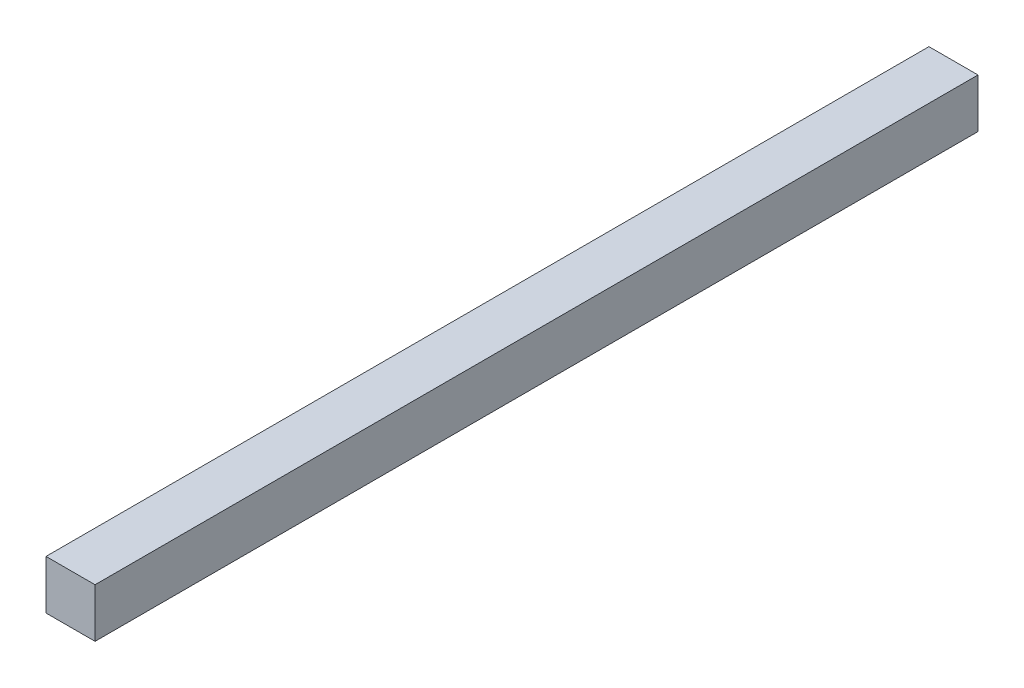
ISO-10303-21;
HEADER;
FILE_DESCRIPTION(('STEP AP214'),'2;1');
FILE_NAME('part.step','',(''),(''),'','','');
FILE_SCHEMA(('AUTOMOTIVE_DESIGN { 1 0 10303 214 1 1 1 1 }'));
ENDSEC;
DATA;
#1=APPLICATION_CONTEXT('core data for automotive mechanical design processes');
#2=APPLICATION_PROTOCOL_DEFINITION('international standard','automotive_design',2000,#1);
#3=PRODUCT_CONTEXT('',#1,'mechanical');
#4=PRODUCT('Part','Part','',(#3));
#5=PRODUCT_RELATED_PRODUCT_CATEGORY('part','',(#4));
#6=PRODUCT_DEFINITION_FORMATION('','',#4);
#7=PRODUCT_DEFINITION_CONTEXT('part definition',#1,'design');
#8=PRODUCT_DEFINITION('design','',#6,#7);
#9=PRODUCT_DEFINITION_SHAPE('','',#8);
#10=(LENGTH_UNIT() NAMED_UNIT(*) SI_UNIT(.MILLI.,.METRE.));
#11=(NAMED_UNIT(*) PLANE_ANGLE_UNIT() SI_UNIT($,.RADIAN.));
#12=(NAMED_UNIT(*) SI_UNIT($,.STERADIAN.) SOLID_ANGLE_UNIT());
#13=UNCERTAINTY_MEASURE_WITH_UNIT(LENGTH_MEASURE(1.E-05),#10,'distance_accuracy_value','');
#14=(GEOMETRIC_REPRESENTATION_CONTEXT(3) GLOBAL_UNCERTAINTY_ASSIGNED_CONTEXT((#13)) GLOBAL_UNIT_ASSIGNED_CONTEXT((#10,
#11,#12)) REPRESENTATION_CONTEXT('',''));
#15=CARTESIAN_POINT('',(0.,0.,0.));
#16=DIRECTION('',(0.,0.,1.));
#17=DIRECTION('',(1.,0.,0.));
#18=AXIS2_PLACEMENT_3D('',#15,#16,#17);
#19=CARTESIAN_POINT('',(20.,-20.,720.));
#20=DIRECTION('',(-1.,0.,0.));
#21=DIRECTION('',(0.,0.,1.));
#22=AXIS2_PLACEMENT_3D('',#19,#20,#21);
#23=PLANE('',#22);
#24=DIRECTION('',(0.,1.,0.));
#25=VECTOR('',#24,1.);
#26=CARTESIAN_POINT('',(20.,-20.,0.));
#27=LINE('',#26,#25);
#28=CARTESIAN_POINT('',(20.,-20.,0.));
#29=VERTEX_POINT('',#28);
#30=CARTESIAN_POINT('',(20.,20.,0.));
#31=VERTEX_POINT('',#30);
#32=EDGE_CURVE('E105',#29,#31,#27,.T.);
#33=ORIENTED_EDGE('',*,*,#32,.T.);
#34=DIRECTION('',(0.,0.,-1.));
#35=VECTOR('',#34,1.);
#36=CARTESIAN_POINT('',(20.,20.,720.));
#37=LINE('',#36,#35);
#38=CARTESIAN_POINT('',(20.,20.,720.));
#39=VERTEX_POINT('',#38);
#40=EDGE_CURVE('E11',#39,#31,#37,.T.);
#41=ORIENTED_EDGE('',*,*,#40,.F.);
#42=DIRECTION('',(0.,1.,0.));
#43=VECTOR('',#42,1.);
#44=CARTESIAN_POINT('',(20.,-20.,720.));
#45=LINE('',#44,#43);
#46=CARTESIAN_POINT('',(20.,-20.,720.));
#47=VERTEX_POINT('',#46);
#48=EDGE_CURVE('E89',#47,#39,#45,.T.);
#49=ORIENTED_EDGE('',*,*,#48,.F.);
#50=DIRECTION('',(0.,0.,-1.));
#51=VECTOR('',#50,1.);
#52=CARTESIAN_POINT('',(20.,-20.,720.));
#53=LINE('',#52,#51);
#54=EDGE_CURVE('E98',#47,#29,#53,.T.);
#55=ORIENTED_EDGE('',*,*,#54,.T.);
#56=EDGE_LOOP('',(#33,#41,#49,#55));
#57=FACE_BOUND('',#56,.T.);
#58=ADVANCED_FACE('F39',(#57),#23,.F.);
#59=CARTESIAN_POINT('',(-20.,20.,720.));
#60=DIRECTION('',(0.,-1.,0.));
#61=DIRECTION('',(0.,0.,-1.));
#62=AXIS2_PLACEMENT_3D('',#59,#60,#61);
#63=PLANE('',#62);
#64=DIRECTION('',(-1.,0.,0.));
#65=VECTOR('',#64,1.);
#66=CARTESIAN_POINT('',(-20.,20.,0.));
#67=LINE('',#66,#65);
#68=CARTESIAN_POINT('',(-20.,20.,0.));
#69=VERTEX_POINT('',#68);
#70=EDGE_CURVE('E94',#31,#69,#67,.T.);
#71=ORIENTED_EDGE('',*,*,#70,.T.);
#72=DIRECTION('',(0.,0.,-1.));
#73=VECTOR('',#72,1.);
#74=CARTESIAN_POINT('',(-20.,20.,720.));
#75=LINE('',#74,#73);
#76=CARTESIAN_POINT('',(-20.,20.,720.));
#77=VERTEX_POINT('',#76);
#78=EDGE_CURVE('E50',#77,#69,#75,.T.);
#79=ORIENTED_EDGE('',*,*,#78,.F.);
#80=DIRECTION('',(-1.,0.,0.));
#81=VECTOR('',#80,1.);
#82=CARTESIAN_POINT('',(-20.,20.,720.));
#83=LINE('',#82,#81);
#84=EDGE_CURVE('E83',#39,#77,#83,.T.);
#85=ORIENTED_EDGE('',*,*,#84,.F.);
#86=ORIENTED_EDGE('',*,*,#40,.T.);
#87=EDGE_LOOP('',(#71,#79,#85,#86));
#88=FACE_BOUND('',#87,.T.);
#89=ADVANCED_FACE('F91',(#88),#63,.F.);
#90=CARTESIAN_POINT('',(-20.,-20.,720.));
#91=DIRECTION('',(1.,0.,0.));
#92=DIRECTION('',(0.,0.,-1.));
#93=AXIS2_PLACEMENT_3D('',#90,#91,#92);
#94=PLANE('',#93);
#95=DIRECTION('',(0.,-1.,0.));
#96=VECTOR('',#95,1.);
#97=CARTESIAN_POINT('',(-20.,-20.,0.));
#98=LINE('',#97,#96);
#99=CARTESIAN_POINT('',(-20.,-20.,0.));
#100=VERTEX_POINT('',#99);
#101=EDGE_CURVE('E75',#69,#100,#98,.T.);
#102=ORIENTED_EDGE('',*,*,#101,.T.);
#103=DIRECTION('',(0.,0.,-1.));
#104=VECTOR('',#103,1.);
#105=CARTESIAN_POINT('',(-20.,-20.,720.));
#106=LINE('',#105,#104);
#107=CARTESIAN_POINT('',(-20.,-20.,720.));
#108=VERTEX_POINT('',#107);
#109=EDGE_CURVE('E92',#108,#100,#106,.T.);
#110=ORIENTED_EDGE('',*,*,#109,.F.);
#111=DIRECTION('',(0.,-1.,0.));
#112=VECTOR('',#111,1.);
#113=CARTESIAN_POINT('',(-20.,-20.,720.));
#114=LINE('',#113,#112);
#115=EDGE_CURVE('E86',#77,#108,#114,.T.);
#116=ORIENTED_EDGE('',*,*,#115,.F.);
#117=ORIENTED_EDGE('',*,*,#78,.T.);
#118=EDGE_LOOP('',(#102,#110,#116,#117));
#119=FACE_BOUND('',#118,.T.);
#120=ADVANCED_FACE('F96',(#119),#94,.F.);
#121=CARTESIAN_POINT('',(-20.,-20.,720.));
#122=DIRECTION('',(0.,1.,0.));
#123=DIRECTION('',(0.,0.,1.));
#124=AXIS2_PLACEMENT_3D('',#121,#122,#123);
#125=PLANE('',#124);
#126=DIRECTION('',(1.,0.,0.));
#127=VECTOR('',#126,1.);
#128=CARTESIAN_POINT('',(-20.,-20.,0.));
#129=LINE('',#128,#127);
#130=EDGE_CURVE('E77',#100,#29,#129,.T.);
#131=ORIENTED_EDGE('',*,*,#130,.T.);
#132=ORIENTED_EDGE('',*,*,#54,.F.);
#133=DIRECTION('',(1.,0.,0.));
#134=VECTOR('',#133,1.);
#135=CARTESIAN_POINT('',(-20.,-20.,720.));
#136=LINE('',#135,#134);
#137=EDGE_CURVE('E54',#108,#47,#136,.T.);
#138=ORIENTED_EDGE('',*,*,#137,.F.);
#139=ORIENTED_EDGE('',*,*,#109,.T.);
#140=EDGE_LOOP('',(#131,#132,#138,#139));
#141=FACE_BOUND('',#140,.T.);
#142=ADVANCED_FACE('F108',(#141),#125,.F.);
#143=CARTESIAN_POINT('',(0.,0.,720.));
#144=DIRECTION('',(0.,0.,-1.));
#145=DIRECTION('',(-1.,0.,0.));
#146=AXIS2_PLACEMENT_3D('',#143,#144,#145);
#147=PLANE('',#146);
#148=ORIENTED_EDGE('',*,*,#48,.T.);
#149=ORIENTED_EDGE('',*,*,#84,.T.);
#150=ORIENTED_EDGE('',*,*,#115,.T.);
#151=ORIENTED_EDGE('',*,*,#137,.T.);
#152=EDGE_LOOP('',(#148,#149,#150,#151));
#153=FACE_BOUND('',#152,.T.);
#154=ADVANCED_FACE('F88',(#153),#147,.F.);
#155=CARTESIAN_POINT('',(0.,0.,0.));
#156=DIRECTION('',(0.,0.,-1.));
#157=DIRECTION('',(-1.,0.,0.));
#158=AXIS2_PLACEMENT_3D('',#155,#156,#157);
#159=PLANE('',#158);
#160=ORIENTED_EDGE('',*,*,#32,.F.);
#161=ORIENTED_EDGE('',*,*,#130,.F.);
#162=ORIENTED_EDGE('',*,*,#101,.F.);
#163=ORIENTED_EDGE('',*,*,#70,.F.);
#164=EDGE_LOOP('',(#160,#161,#162,#163));
#165=FACE_BOUND('',#164,.T.);
#166=ADVANCED_FACE('F115',(#165),#159,.T.);
#167=CLOSED_SHELL('',(#58,#89,#120,#142,#154,#166));
#168=MANIFOLD_SOLID_BREP('B2',#167);
#169=ADVANCED_BREP_SHAPE_REPRESENTATION('',(#18,#168),#14);
#170=SHAPE_DEFINITION_REPRESENTATION(#9,#169);
ENDSEC;
END-ISO-10303-21;
